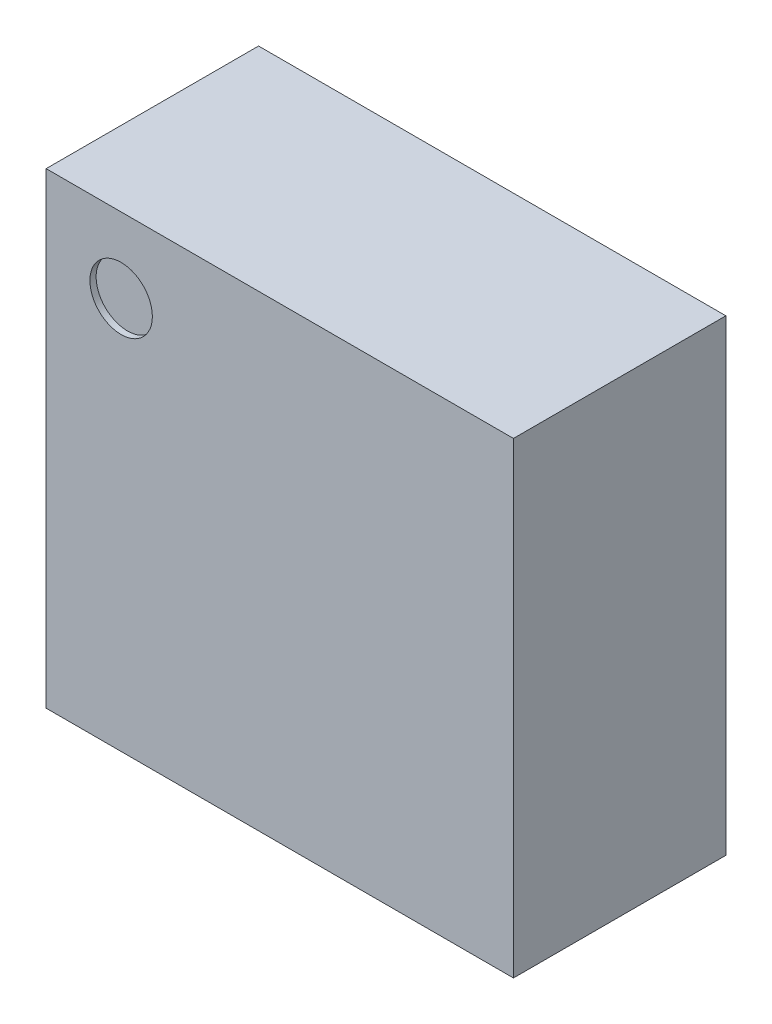
ISO-10303-21;
HEADER;
FILE_DESCRIPTION(('STEP AP214'),'2;1');
FILE_NAME('part.step','',(''),(''),'','','');
FILE_SCHEMA(('AUTOMOTIVE_DESIGN { 1 0 10303 214 1 1 1 1 }'));
ENDSEC;
DATA;
#1=APPLICATION_CONTEXT('core data for automotive mechanical design processes');
#2=APPLICATION_PROTOCOL_DEFINITION('international standard','automotive_design',2000,#1);
#3=PRODUCT_CONTEXT('',#1,'mechanical');
#4=PRODUCT('Part','Part','',(#3));
#5=PRODUCT_RELATED_PRODUCT_CATEGORY('part','',(#4));
#6=PRODUCT_DEFINITION_FORMATION('','',#4);
#7=PRODUCT_DEFINITION_CONTEXT('part definition',#1,'design');
#8=PRODUCT_DEFINITION('design','',#6,#7);
#9=PRODUCT_DEFINITION_SHAPE('','',#8);
#10=(LENGTH_UNIT() NAMED_UNIT(*) SI_UNIT(.MILLI.,.METRE.));
#11=(NAMED_UNIT(*) PLANE_ANGLE_UNIT() SI_UNIT($,.RADIAN.));
#12=(NAMED_UNIT(*) SI_UNIT($,.STERADIAN.) SOLID_ANGLE_UNIT());
#13=UNCERTAINTY_MEASURE_WITH_UNIT(LENGTH_MEASURE(1.E-05),#10,'distance_accuracy_value','');
#14=(GEOMETRIC_REPRESENTATION_CONTEXT(3) GLOBAL_UNCERTAINTY_ASSIGNED_CONTEXT((#13)) GLOBAL_UNIT_ASSIGNED_CONTEXT((#10,
#11,#12)) REPRESENTATION_CONTEXT('',''));
#15=CARTESIAN_POINT('',(0.,0.,0.));
#16=DIRECTION('',(0.,0.,1.));
#17=DIRECTION('',(1.,0.,0.));
#18=AXIS2_PLACEMENT_3D('',#15,#16,#17);
#19=CARTESIAN_POINT('',(0.,0.,0.45000000000074));
#20=DIRECTION('',(0.,0.,1.));
#21=DIRECTION('',(1.,0.,0.));
#22=AXIS2_PLACEMENT_3D('',#19,#20,#21);
#23=PLANE('',#22);
#24=CARTESIAN_POINT('',(-0.254,0.254,0.45000000000074));
#25=DIRECTION('',(0.,0.,1.));
#26=DIRECTION('',(1.,0.,0.));
#27=AXIS2_PLACEMENT_3D('',#24,#25,#26);
#28=CIRCLE('',#27,0.0500000000000032);
#29=CARTESIAN_POINT('',(-0.203999999999997,0.254,0.45000000000074));
#30=VERTEX_POINT('',#29);
#31=EDGE_CURVE('E20',#30,#30,#28,.T.);
#32=ORIENTED_EDGE('',*,*,#31,.T.);
#33=EDGE_LOOP('',(#32));
#34=FACE_BOUND('',#33,.T.);
#35=ADVANCED_FACE('F17',(#34),#23,.T.);
#36=CARTESIAN_POINT('',(-0.254,0.254,0.4600000000007));
#37=DIRECTION('',(0.,0.,1.));
#38=DIRECTION('',(1.,0.,0.));
#39=AXIS2_PLACEMENT_3D('',#36,#37,#38);
#40=CYLINDRICAL_SURFACE('',#39,0.0500000000000032);
#41=ORIENTED_EDGE('',*,*,#31,.F.);
#42=EDGE_LOOP('',(#41));
#43=FACE_BOUND('',#42,.T.);
#44=CARTESIAN_POINT('',(-0.254,0.254,0.4600000000007));
#45=DIRECTION('',(0.,0.,1.));
#46=DIRECTION('',(1.,0.,0.));
#47=AXIS2_PLACEMENT_3D('',#44,#45,#46);
#48=CIRCLE('',#47,0.0500000000000032);
#49=CARTESIAN_POINT('',(-0.203999999999997,0.254,0.4600000000007));
#50=VERTEX_POINT('',#49);
#51=EDGE_CURVE('E75',#50,#50,#48,.F.);
#52=ORIENTED_EDGE('',*,*,#51,.F.);
#53=EDGE_LOOP('',(#52));
#54=FACE_BOUND('',#53,.T.);
#55=ADVANCED_FACE('F90',(#43,#54),#40,.F.);
#56=CARTESIAN_POINT('',(0.,0.,0.4600000000007));
#57=DIRECTION('',(0.,0.,1.));
#58=DIRECTION('',(1.,0.,0.));
#59=AXIS2_PLACEMENT_3D('',#56,#57,#58);
#60=PLANE('',#59);
#61=ORIENTED_EDGE('',*,*,#51,.T.);
#62=EDGE_LOOP('',(#61));
#63=FACE_BOUND('',#62,.T.);
#64=DIRECTION('',(1.,0.,0.));
#65=VECTOR('',#64,1.);
#66=CARTESIAN_POINT('',(0.374000000000028,0.374000000000028,0.4600000000007));
#67=LINE('',#66,#65);
#68=CARTESIAN_POINT('',(-0.374000000000028,0.374000000000028,0.4600000000007));
#69=VERTEX_POINT('',#68);
#70=CARTESIAN_POINT('',(0.374000000000028,0.374000000000028,0.4600000000007));
#71=VERTEX_POINT('',#70);
#72=EDGE_CURVE('E71',#69,#71,#67,.T.);
#73=ORIENTED_EDGE('',*,*,#72,.F.);
#74=DIRECTION('',(0.,1.,0.));
#75=VECTOR('',#74,1.);
#76=CARTESIAN_POINT('',(-0.374000000000028,0.374000000000028,0.4600000000007));
#77=LINE('',#76,#75);
#78=CARTESIAN_POINT('',(-0.374000000000028,-0.374000000000028,0.4600000000007));
#79=VERTEX_POINT('',#78);
#80=EDGE_CURVE('E67',#79,#69,#77,.T.);
#81=ORIENTED_EDGE('',*,*,#80,.F.);
#82=DIRECTION('',(1.,0.,0.));
#83=VECTOR('',#82,1.);
#84=CARTESIAN_POINT('',(-0.374000000000028,-0.374000000000028,0.4600000000007));
#85=LINE('',#84,#83);
#86=CARTESIAN_POINT('',(0.374000000000028,-0.374000000000028,0.4600000000007));
#87=VERTEX_POINT('',#86);
#88=EDGE_CURVE('E58',#87,#79,#85,.F.);
#89=ORIENTED_EDGE('',*,*,#88,.F.);
#90=DIRECTION('',(0.,1.,0.));
#91=VECTOR('',#90,1.);
#92=CARTESIAN_POINT('',(0.374000000000028,-0.374000000000028,0.4600000000007));
#93=LINE('',#92,#91);
#94=EDGE_CURVE('E53',#71,#87,#93,.F.);
#95=ORIENTED_EDGE('',*,*,#94,.F.);
#96=EDGE_LOOP('',(#73,#81,#89,#95));
#97=FACE_BOUND('',#96,.T.);
#98=ADVANCED_FACE('F70',(#63,#97),#60,.T.);
#99=CARTESIAN_POINT('',(-0.374000000000028,0.374000000000028,0.));
#100=DIRECTION('',(-1.,0.,0.));
#101=DIRECTION('',(0.,0.,1.));
#102=AXIS2_PLACEMENT_3D('',#99,#100,#101);
#103=PLANE('',#102);
#104=DIRECTION('',(0.,0.,1.));
#105=VECTOR('',#104,1.);
#106=CARTESIAN_POINT('',(-0.374000000000028,0.374000000000028,0.));
#107=LINE('',#106,#105);
#108=CARTESIAN_POINT('',(-0.374000000000028,0.374000000000028,0.11999999999952));
#109=VERTEX_POINT('',#108);
#110=EDGE_CURVE('E197',#109,#69,#107,.T.);
#111=ORIENTED_EDGE('',*,*,#110,.F.);
#112=DIRECTION('',(0.,1.,0.));
#113=VECTOR('',#112,1.);
#114=CARTESIAN_POINT('',(-0.374000000000028,0.,0.11999999999952));
#115=LINE('',#114,#113);
#116=CARTESIAN_POINT('',(-0.374000000000028,-0.374000000000028,0.11999999999952));
#117=VERTEX_POINT('',#116);
#118=EDGE_CURVE('E79',#109,#117,#115,.F.);
#119=ORIENTED_EDGE('',*,*,#118,.T.);
#120=DIRECTION('',(0.,0.,-1.));
#121=VECTOR('',#120,1.);
#122=CARTESIAN_POINT('',(-0.374000000000028,-0.374000000000028,0.));
#123=LINE('',#122,#121);
#124=EDGE_CURVE('E63',#79,#117,#123,.T.);
#125=ORIENTED_EDGE('',*,*,#124,.F.);
#126=ORIENTED_EDGE('',*,*,#80,.T.);
#127=EDGE_LOOP('',(#111,#119,#125,#126));
#128=FACE_BOUND('',#127,.T.);
#129=ADVANCED_FACE('F78',(#128),#103,.T.);
#130=CARTESIAN_POINT('',(-0.374000000000028,-0.374000000000028,0.));
#131=DIRECTION('',(0.,-1.,0.));
#132=DIRECTION('',(0.,0.,-1.));
#133=AXIS2_PLACEMENT_3D('',#130,#131,#132);
#134=PLANE('',#133);
#135=ORIENTED_EDGE('',*,*,#124,.T.);
#136=DIRECTION('',(1.,0.,0.));
#137=VECTOR('',#136,1.);
#138=CARTESIAN_POINT('',(0.,-0.374000000000028,0.11999999999952));
#139=LINE('',#138,#137);
#140=CARTESIAN_POINT('',(0.374000000000028,-0.374000000000028,0.11999999999952));
#141=VERTEX_POINT('',#140);
#142=EDGE_CURVE('E198',#117,#141,#139,.T.);
#143=ORIENTED_EDGE('',*,*,#142,.T.);
#144=DIRECTION('',(0.,0.,-1.));
#145=VECTOR('',#144,1.);
#146=CARTESIAN_POINT('',(0.374000000000028,-0.374000000000028,0.));
#147=LINE('',#146,#145);
#148=EDGE_CURVE('E65',#87,#141,#147,.T.);
#149=ORIENTED_EDGE('',*,*,#148,.F.);
#150=ORIENTED_EDGE('',*,*,#88,.T.);
#151=EDGE_LOOP('',(#135,#143,#149,#150));
#152=FACE_BOUND('',#151,.T.);
#153=ADVANCED_FACE('F60',(#152),#134,.T.);
#154=CARTESIAN_POINT('',(0.374000000000028,-0.374000000000028,0.));
#155=DIRECTION('',(1.,0.,0.));
#156=DIRECTION('',(0.,0.,-1.));
#157=AXIS2_PLACEMENT_3D('',#154,#155,#156);
#158=PLANE('',#157);
#159=ORIENTED_EDGE('',*,*,#148,.T.);
#160=DIRECTION('',(0.,1.,0.));
#161=VECTOR('',#160,1.);
#162=CARTESIAN_POINT('',(0.374000000000028,0.,0.11999999999952));
#163=LINE('',#162,#161);
#164=CARTESIAN_POINT('',(0.374000000000028,0.374000000000028,0.11999999999952));
#165=VERTEX_POINT('',#164);
#166=EDGE_CURVE('E26',#141,#165,#163,.T.);
#167=ORIENTED_EDGE('',*,*,#166,.T.);
#168=DIRECTION('',(0.,0.,1.));
#169=VECTOR('',#168,1.);
#170=CARTESIAN_POINT('',(0.374000000000028,0.374000000000028,0.));
#171=LINE('',#170,#169);
#172=EDGE_CURVE('E34',#71,#165,#171,.F.);
#173=ORIENTED_EDGE('',*,*,#172,.F.);
#174=ORIENTED_EDGE('',*,*,#94,.T.);
#175=EDGE_LOOP('',(#159,#167,#173,#174));
#176=FACE_BOUND('',#175,.T.);
#177=ADVANCED_FACE('F107',(#176),#158,.T.);
#178=CARTESIAN_POINT('',(0.374000000000028,0.374000000000028,0.));
#179=DIRECTION('',(0.,1.,0.));
#180=DIRECTION('',(0.,0.,1.));
#181=AXIS2_PLACEMENT_3D('',#178,#179,#180);
#182=PLANE('',#181);
#183=ORIENTED_EDGE('',*,*,#172,.T.);
#184=DIRECTION('',(1.,0.,0.));
#185=VECTOR('',#184,1.);
#186=CARTESIAN_POINT('',(0.,0.374000000000028,0.11999999999952));
#187=LINE('',#186,#185);
#188=EDGE_CURVE('E11',#165,#109,#187,.F.);
#189=ORIENTED_EDGE('',*,*,#188,.T.);
#190=ORIENTED_EDGE('',*,*,#110,.T.);
#191=ORIENTED_EDGE('',*,*,#72,.T.);
#192=EDGE_LOOP('',(#183,#189,#190,#191));
#193=FACE_BOUND('',#192,.T.);
#194=ADVANCED_FACE('F101',(#193),#182,.T.);
#195=CARTESIAN_POINT('',(0.,0.,0.11999999999952));
#196=DIRECTION('',(0.,0.,1.));
#197=DIRECTION('',(1.,0.,0.));
#198=AXIS2_PLACEMENT_3D('',#195,#196,#197);
#199=PLANE('',#198);
#200=ORIENTED_EDGE('',*,*,#166,.F.);
#201=ORIENTED_EDGE('',*,*,#142,.F.);
#202=ORIENTED_EDGE('',*,*,#118,.F.);
#203=ORIENTED_EDGE('',*,*,#188,.F.);
#204=EDGE_LOOP('',(#200,#201,#202,#203));
#205=FACE_BOUND('',#204,.T.);
#206=ADVANCED_FACE('F99',(#205),#199,.F.);
#207=CLOSED_SHELL('',(#35,#55,#98,#129,#153,#177,#194,#206));
#208=MANIFOLD_SOLID_BREP('B1',#207);
#209=ADVANCED_BREP_SHAPE_REPRESENTATION('',(#18,#208),#14);
#210=SHAPE_DEFINITION_REPRESENTATION(#9,#209);
ENDSEC;
END-ISO-10303-21;
